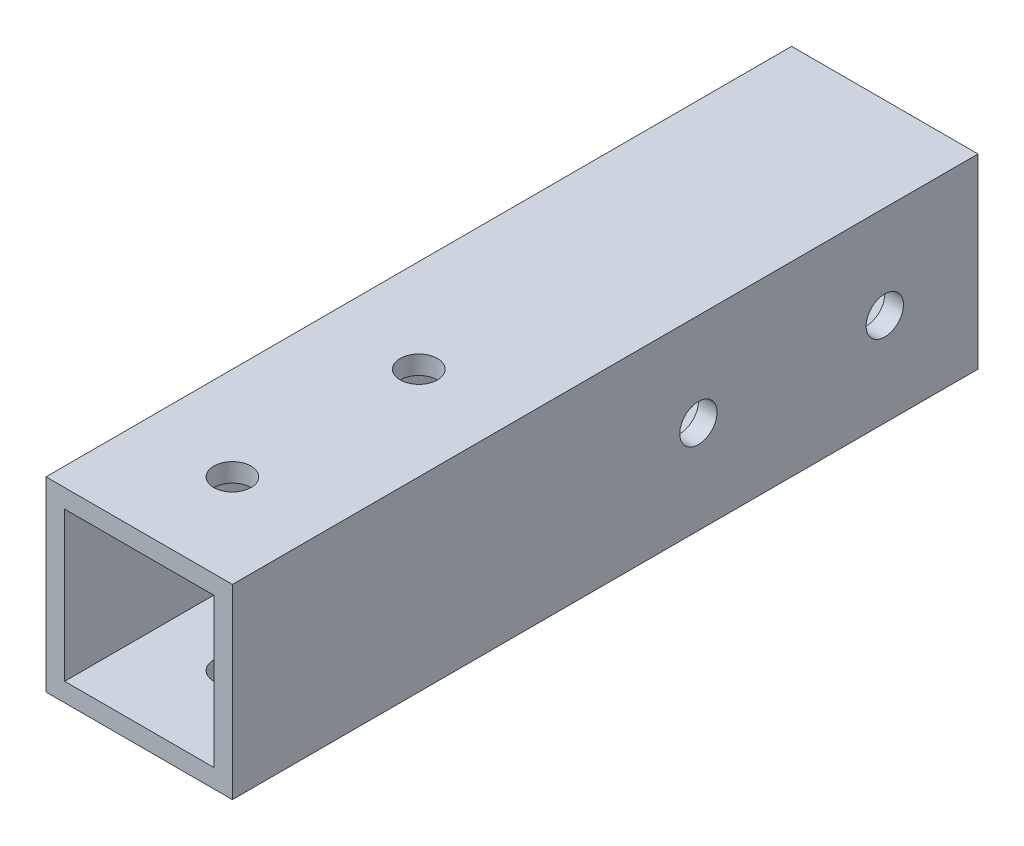
ISO-10303-21;
HEADER;
FILE_DESCRIPTION(('STEP AP214'),'2;1');
FILE_NAME('part.step','',(''),(''),'','','');
FILE_SCHEMA(('AUTOMOTIVE_DESIGN { 1 0 10303 214 1 1 1 1 }'));
ENDSEC;
DATA;
#1=APPLICATION_CONTEXT('core data for automotive mechanical design processes');
#2=APPLICATION_PROTOCOL_DEFINITION('international standard','automotive_design',2000,#1);
#3=PRODUCT_CONTEXT('',#1,'mechanical');
#4=PRODUCT('Part','Part','',(#3));
#5=PRODUCT_RELATED_PRODUCT_CATEGORY('part','',(#4));
#6=PRODUCT_DEFINITION_FORMATION('','',#4);
#7=PRODUCT_DEFINITION_CONTEXT('part definition',#1,'design');
#8=PRODUCT_DEFINITION('design','',#6,#7);
#9=PRODUCT_DEFINITION_SHAPE('','',#8);
#10=(LENGTH_UNIT() NAMED_UNIT(*) SI_UNIT(.MILLI.,.METRE.));
#11=(NAMED_UNIT(*) PLANE_ANGLE_UNIT() SI_UNIT($,.RADIAN.));
#12=(NAMED_UNIT(*) SI_UNIT($,.STERADIAN.) SOLID_ANGLE_UNIT());
#13=UNCERTAINTY_MEASURE_WITH_UNIT(LENGTH_MEASURE(1.E-05),#10,'distance_accuracy_value','');
#14=(GEOMETRIC_REPRESENTATION_CONTEXT(3) GLOBAL_UNCERTAINTY_ASSIGNED_CONTEXT((#13)) GLOBAL_UNIT_ASSIGNED_CONTEXT((#10,
#11,#12)) REPRESENTATION_CONTEXT('',''));
#15=CARTESIAN_POINT('',(0.,0.,0.));
#16=DIRECTION('',(0.,0.,1.));
#17=DIRECTION('',(1.,0.,0.));
#18=AXIS2_PLACEMENT_3D('',#15,#16,#17);
#19=CARTESIAN_POINT('',(0.,0.,80.));
#20=DIRECTION('',(0.,0.,-1.));
#21=DIRECTION('',(-1.,0.,0.));
#22=AXIS2_PLACEMENT_3D('',#19,#20,#21);
#23=PLANE('',#22);
#24=DIRECTION('',(0.,1.,0.));
#25=VECTOR('',#24,1.);
#26=CARTESIAN_POINT('',(10.,-10.,80.));
#27=LINE('',#26,#25);
#28=CARTESIAN_POINT('',(10.,-10.,80.));
#29=VERTEX_POINT('',#28);
#30=CARTESIAN_POINT('',(10.,10.,80.));
#31=VERTEX_POINT('',#30);
#32=EDGE_CURVE('E151',#29,#31,#27,.T.);
#33=ORIENTED_EDGE('',*,*,#32,.T.);
#34=DIRECTION('',(-1.,0.,0.));
#35=VECTOR('',#34,1.);
#36=CARTESIAN_POINT('',(-10.,10.,80.));
#37=LINE('',#36,#35);
#38=CARTESIAN_POINT('',(-10.,10.,80.));
#39=VERTEX_POINT('',#38);
#40=EDGE_CURVE('E154',#31,#39,#37,.T.);
#41=ORIENTED_EDGE('',*,*,#40,.T.);
#42=DIRECTION('',(0.,-1.,0.));
#43=VECTOR('',#42,1.);
#44=CARTESIAN_POINT('',(-10.,-10.,80.));
#45=LINE('',#44,#43);
#46=CARTESIAN_POINT('',(-10.,-10.,80.));
#47=VERTEX_POINT('',#46);
#48=EDGE_CURVE('E157',#39,#47,#45,.T.);
#49=ORIENTED_EDGE('',*,*,#48,.T.);
#50=DIRECTION('',(1.,0.,0.));
#51=VECTOR('',#50,1.);
#52=CARTESIAN_POINT('',(-10.,-10.,80.));
#53=LINE('',#52,#51);
#54=EDGE_CURVE('E159',#47,#29,#53,.T.);
#55=ORIENTED_EDGE('',*,*,#54,.T.);
#56=EDGE_LOOP('',(#33,#41,#49,#55));
#57=FACE_BOUND('',#56,.T.);
#58=DIRECTION('',(1.,0.,0.));
#59=VECTOR('',#58,1.);
#60=CARTESIAN_POINT('',(-8.,-8.,80.));
#61=LINE('',#60,#59);
#62=CARTESIAN_POINT('',(-8.,-8.,80.));
#63=VERTEX_POINT('',#62);
#64=CARTESIAN_POINT('',(8.,-8.,80.));
#65=VERTEX_POINT('',#64);
#66=EDGE_CURVE('E113',#63,#65,#61,.T.);
#67=ORIENTED_EDGE('',*,*,#66,.F.);
#68=DIRECTION('',(0.,-1.,0.));
#69=VECTOR('',#68,1.);
#70=CARTESIAN_POINT('',(-8.,-8.,80.));
#71=LINE('',#70,#69);
#72=CARTESIAN_POINT('',(-8.,8.,80.));
#73=VERTEX_POINT('',#72);
#74=EDGE_CURVE('E135',#73,#63,#71,.T.);
#75=ORIENTED_EDGE('',*,*,#74,.F.);
#76=DIRECTION('',(-1.,0.,0.));
#77=VECTOR('',#76,1.);
#78=CARTESIAN_POINT('',(-8.,8.,80.));
#79=LINE('',#78,#77);
#80=CARTESIAN_POINT('',(8.,8.,80.));
#81=VERTEX_POINT('',#80);
#82=EDGE_CURVE('E133',#81,#73,#79,.T.);
#83=ORIENTED_EDGE('',*,*,#82,.F.);
#84=DIRECTION('',(0.,1.,0.));
#85=VECTOR('',#84,1.);
#86=CARTESIAN_POINT('',(8.,-8.,80.));
#87=LINE('',#86,#85);
#88=EDGE_CURVE('E121',#65,#81,#87,.T.);
#89=ORIENTED_EDGE('',*,*,#88,.F.);
#90=EDGE_LOOP('',(#67,#75,#83,#89));
#91=FACE_BOUND('',#90,.T.);
#92=ADVANCED_FACE('F46',(#57,#91),#23,.F.);
#93=CARTESIAN_POINT('',(0.,0.,0.));
#94=DIRECTION('',(0.,0.,-1.));
#95=DIRECTION('',(-1.,0.,0.));
#96=AXIS2_PLACEMENT_3D('',#93,#94,#95);
#97=PLANE('',#96);
#98=DIRECTION('',(0.,1.,0.));
#99=VECTOR('',#98,1.);
#100=CARTESIAN_POINT('',(10.,-10.,0.));
#101=LINE('',#100,#99);
#102=CARTESIAN_POINT('',(10.,-10.,0.));
#103=VERTEX_POINT('',#102);
#104=CARTESIAN_POINT('',(10.,10.,0.));
#105=VERTEX_POINT('',#104);
#106=EDGE_CURVE('E129',#103,#105,#101,.T.);
#107=ORIENTED_EDGE('',*,*,#106,.F.);
#108=DIRECTION('',(1.,0.,0.));
#109=VECTOR('',#108,1.);
#110=CARTESIAN_POINT('',(-10.,-10.,0.));
#111=LINE('',#110,#109);
#112=CARTESIAN_POINT('',(-10.,-10.,0.));
#113=VERTEX_POINT('',#112);
#114=EDGE_CURVE('E155',#113,#103,#111,.T.);
#115=ORIENTED_EDGE('',*,*,#114,.F.);
#116=DIRECTION('',(0.,-1.,0.));
#117=VECTOR('',#116,1.);
#118=CARTESIAN_POINT('',(-10.,-10.,0.));
#119=LINE('',#118,#117);
#120=CARTESIAN_POINT('',(-10.,10.,0.));
#121=VERTEX_POINT('',#120);
#122=EDGE_CURVE('E291',#121,#113,#119,.T.);
#123=ORIENTED_EDGE('',*,*,#122,.F.);
#124=DIRECTION('',(-1.,0.,0.));
#125=VECTOR('',#124,1.);
#126=CARTESIAN_POINT('',(-10.,10.,0.));
#127=LINE('',#126,#125);
#128=EDGE_CURVE('E285',#105,#121,#127,.T.);
#129=ORIENTED_EDGE('',*,*,#128,.F.);
#130=EDGE_LOOP('',(#107,#115,#123,#129));
#131=FACE_BOUND('',#130,.T.);
#132=DIRECTION('',(0.,-1.,0.));
#133=VECTOR('',#132,1.);
#134=CARTESIAN_POINT('',(-8.,-8.,0.));
#135=LINE('',#134,#133);
#136=CARTESIAN_POINT('',(-8.,8.,0.));
#137=VERTEX_POINT('',#136);
#138=CARTESIAN_POINT('',(-8.,-8.,0.));
#139=VERTEX_POINT('',#138);
#140=EDGE_CURVE('E122',#137,#139,#135,.T.);
#141=ORIENTED_EDGE('',*,*,#140,.T.);
#142=DIRECTION('',(1.,0.,0.));
#143=VECTOR('',#142,1.);
#144=CARTESIAN_POINT('',(-8.,-8.,0.));
#145=LINE('',#144,#143);
#146=CARTESIAN_POINT('',(8.,-8.,0.));
#147=VERTEX_POINT('',#146);
#148=EDGE_CURVE('E71',#139,#147,#145,.T.);
#149=ORIENTED_EDGE('',*,*,#148,.T.);
#150=DIRECTION('',(0.,1.,0.));
#151=VECTOR('',#150,1.);
#152=CARTESIAN_POINT('',(8.,-8.,0.));
#153=LINE('',#152,#151);
#154=CARTESIAN_POINT('',(8.,8.,0.));
#155=VERTEX_POINT('',#154);
#156=EDGE_CURVE('E128',#147,#155,#153,.T.);
#157=ORIENTED_EDGE('',*,*,#156,.T.);
#158=DIRECTION('',(-1.,0.,0.));
#159=VECTOR('',#158,1.);
#160=CARTESIAN_POINT('',(-8.,8.,0.));
#161=LINE('',#160,#159);
#162=EDGE_CURVE('E143',#155,#137,#161,.T.);
#163=ORIENTED_EDGE('',*,*,#162,.T.);
#164=EDGE_LOOP('',(#141,#149,#157,#163));
#165=FACE_BOUND('',#164,.T.);
#166=ADVANCED_FACE('F257',(#131,#165),#97,.T.);
#167=CARTESIAN_POINT('',(10.,-10.,80.));
#168=DIRECTION('',(-1.,0.,0.));
#169=DIRECTION('',(0.,-1.,0.));
#170=AXIS2_PLACEMENT_3D('',#167,#168,#169);
#171=PLANE('',#170);
#172=CARTESIAN_POINT('',(10.,0.,10.));
#173=DIRECTION('',(1.,0.,0.));
#174=DIRECTION('',(0.,1.,0.));
#175=AXIS2_PLACEMENT_3D('',#172,#173,#174);
#176=CIRCLE('',#175,2.);
#177=CARTESIAN_POINT('',(10.,2.,10.));
#178=VERTEX_POINT('',#177);
#179=EDGE_CURVE('E186',#178,#178,#176,.T.);
#180=ORIENTED_EDGE('',*,*,#179,.F.);
#181=EDGE_LOOP('',(#180));
#182=FACE_BOUND('',#181,.T.);
#183=CARTESIAN_POINT('',(10.,-1.4206298902349E-13,30.));
#184=DIRECTION('',(1.,0.,0.));
#185=DIRECTION('',(0.,1.,0.));
#186=AXIS2_PLACEMENT_3D('',#183,#184,#185);
#187=CIRCLE('',#186,2.);
#188=CARTESIAN_POINT('',(10.,1.99999999999986,30.));
#189=VERTEX_POINT('',#188);
#190=EDGE_CURVE('E221',#189,#189,#187,.T.);
#191=ORIENTED_EDGE('',*,*,#190,.F.);
#192=EDGE_LOOP('',(#191));
#193=FACE_BOUND('',#192,.T.);
#194=ORIENTED_EDGE('',*,*,#106,.T.);
#195=DIRECTION('',(0.,0.,-1.));
#196=VECTOR('',#195,1.);
#197=CARTESIAN_POINT('',(10.,10.,80.));
#198=LINE('',#197,#196);
#199=EDGE_CURVE('E12',#31,#105,#198,.T.);
#200=ORIENTED_EDGE('',*,*,#199,.F.);
#201=ORIENTED_EDGE('',*,*,#32,.F.);
#202=DIRECTION('',(0.,0.,-1.));
#203=VECTOR('',#202,1.);
#204=CARTESIAN_POINT('',(10.,-10.,80.));
#205=LINE('',#204,#203);
#206=EDGE_CURVE('E163',#29,#103,#205,.T.);
#207=ORIENTED_EDGE('',*,*,#206,.T.);
#208=EDGE_LOOP('',(#194,#200,#201,#207));
#209=FACE_BOUND('',#208,.T.);
#210=ADVANCED_FACE('F48',(#182,#193,#209),#171,.F.);
#211=CARTESIAN_POINT('',(-10.,10.,80.));
#212=DIRECTION('',(0.,-1.,0.));
#213=DIRECTION('',(1.,0.,0.));
#214=AXIS2_PLACEMENT_3D('',#211,#212,#213);
#215=PLANE('',#214);
#216=CARTESIAN_POINT('',(0.,10.,50.));
#217=DIRECTION('',(0.,-1.,0.));
#218=DIRECTION('',(1.,0.,0.));
#219=AXIS2_PLACEMENT_3D('',#216,#217,#218);
#220=CIRCLE('',#219,2.00000000000001);
#221=CARTESIAN_POINT('',(2.00000000000001,10.,50.));
#222=VERTEX_POINT('',#221);
#223=EDGE_CURVE('E218',#222,#222,#220,.T.);
#224=ORIENTED_EDGE('',*,*,#223,.T.);
#225=EDGE_LOOP('',(#224));
#226=FACE_BOUND('',#225,.T.);
#227=CARTESIAN_POINT('',(0.,10.,70.));
#228=DIRECTION('',(0.,-1.,0.));
#229=DIRECTION('',(1.,0.,0.));
#230=AXIS2_PLACEMENT_3D('',#227,#228,#229);
#231=CIRCLE('',#230,2.);
#232=CARTESIAN_POINT('',(2.00000000000001,10.,70.));
#233=VERTEX_POINT('',#232);
#234=EDGE_CURVE('E198',#233,#233,#231,.T.);
#235=ORIENTED_EDGE('',*,*,#234,.T.);
#236=EDGE_LOOP('',(#235));
#237=FACE_BOUND('',#236,.T.);
#238=ORIENTED_EDGE('',*,*,#128,.T.);
#239=DIRECTION('',(0.,0.,-1.));
#240=VECTOR('',#239,1.);
#241=CARTESIAN_POINT('',(-10.,10.,80.));
#242=LINE('',#241,#240);
#243=EDGE_CURVE('E55',#39,#121,#242,.T.);
#244=ORIENTED_EDGE('',*,*,#243,.F.);
#245=ORIENTED_EDGE('',*,*,#40,.F.);
#246=ORIENTED_EDGE('',*,*,#199,.T.);
#247=EDGE_LOOP('',(#238,#244,#245,#246));
#248=FACE_BOUND('',#247,.T.);
#249=ADVANCED_FACE('F273',(#226,#237,#248),#215,.F.);
#250=CARTESIAN_POINT('',(-10.,-10.,80.));
#251=DIRECTION('',(1.,0.,0.));
#252=DIRECTION('',(0.,0.,-1.));
#253=AXIS2_PLACEMENT_3D('',#250,#251,#252);
#254=PLANE('',#253);
#255=CARTESIAN_POINT('',(-10.,0.,10.));
#256=DIRECTION('',(1.,0.,0.));
#257=DIRECTION('',(0.,0.,-1.));
#258=AXIS2_PLACEMENT_3D('',#255,#256,#257);
#259=CIRCLE('',#258,2.);
#260=CARTESIAN_POINT('',(-10.,0.,8.));
#261=VERTEX_POINT('',#260);
#262=EDGE_CURVE('E141',#261,#261,#259,.T.);
#263=ORIENTED_EDGE('',*,*,#262,.T.);
#264=EDGE_LOOP('',(#263));
#265=FACE_BOUND('',#264,.T.);
#266=CARTESIAN_POINT('',(-10.,-1.43797712499467E-13,30.));
#267=DIRECTION('',(1.,0.,0.));
#268=DIRECTION('',(0.,0.,-1.));
#269=AXIS2_PLACEMENT_3D('',#266,#267,#268);
#270=CIRCLE('',#269,2.);
#271=CARTESIAN_POINT('',(-10.,-1.43797712499467E-13,28.));
#272=VERTEX_POINT('',#271);
#273=EDGE_CURVE('E190',#272,#272,#270,.T.);
#274=ORIENTED_EDGE('',*,*,#273,.T.);
#275=EDGE_LOOP('',(#274));
#276=FACE_BOUND('',#275,.T.);
#277=ORIENTED_EDGE('',*,*,#122,.T.);
#278=DIRECTION('',(0.,0.,-1.));
#279=VECTOR('',#278,1.);
#280=CARTESIAN_POINT('',(-10.,-10.,80.));
#281=LINE('',#280,#279);
#282=EDGE_CURVE('E173',#47,#113,#281,.T.);
#283=ORIENTED_EDGE('',*,*,#282,.F.);
#284=ORIENTED_EDGE('',*,*,#48,.F.);
#285=ORIENTED_EDGE('',*,*,#243,.T.);
#286=EDGE_LOOP('',(#277,#283,#284,#285));
#287=FACE_BOUND('',#286,.T.);
#288=ADVANCED_FACE('F234',(#265,#276,#287),#254,.F.);
#289=CARTESIAN_POINT('',(-10.,-10.,80.));
#290=DIRECTION('',(0.,1.,0.));
#291=DIRECTION('',(-1.,0.,0.));
#292=AXIS2_PLACEMENT_3D('',#289,#290,#291);
#293=PLANE('',#292);
#294=CARTESIAN_POINT('',(0.,-10.,50.));
#295=DIRECTION('',(0.,-1.,0.));
#296=DIRECTION('',(1.,0.,0.));
#297=AXIS2_PLACEMENT_3D('',#294,#295,#296);
#298=CIRCLE('',#297,2.00000000000001);
#299=CARTESIAN_POINT('',(2.00000000000001,-10.,50.));
#300=VERTEX_POINT('',#299);
#301=EDGE_CURVE('E194',#300,#300,#298,.T.);
#302=ORIENTED_EDGE('',*,*,#301,.F.);
#303=EDGE_LOOP('',(#302));
#304=FACE_BOUND('',#303,.T.);
#305=CARTESIAN_POINT('',(0.,-10.,70.));
#306=DIRECTION('',(0.,-1.,0.));
#307=DIRECTION('',(1.,0.,0.));
#308=AXIS2_PLACEMENT_3D('',#305,#306,#307);
#309=CIRCLE('',#308,2.);
#310=CARTESIAN_POINT('',(2.00000000000001,-10.,70.));
#311=VERTEX_POINT('',#310);
#312=EDGE_CURVE('E202',#311,#311,#309,.T.);
#313=ORIENTED_EDGE('',*,*,#312,.F.);
#314=EDGE_LOOP('',(#313));
#315=FACE_BOUND('',#314,.T.);
#316=ORIENTED_EDGE('',*,*,#114,.T.);
#317=ORIENTED_EDGE('',*,*,#206,.F.);
#318=ORIENTED_EDGE('',*,*,#54,.F.);
#319=ORIENTED_EDGE('',*,*,#282,.T.);
#320=EDGE_LOOP('',(#316,#317,#318,#319));
#321=FACE_BOUND('',#320,.T.);
#322=ADVANCED_FACE('F268',(#304,#315,#321),#293,.F.);
#323=CARTESIAN_POINT('',(-8.,-8.,80.));
#324=DIRECTION('',(0.,1.,0.));
#325=DIRECTION('',(0.,0.,1.));
#326=AXIS2_PLACEMENT_3D('',#323,#324,#325);
#327=PLANE('',#326);
#328=CARTESIAN_POINT('',(0.,-8.00000000000001,50.));
#329=DIRECTION('',(0.,1.,0.));
#330=DIRECTION('',(0.,0.,1.));
#331=AXIS2_PLACEMENT_3D('',#328,#329,#330);
#332=CIRCLE('',#331,2.00000000000001);
#333=CARTESIAN_POINT('',(0.,-8.00000000000001,52.));
#334=VERTEX_POINT('',#333);
#335=EDGE_CURVE('E215',#334,#334,#332,.T.);
#336=ORIENTED_EDGE('',*,*,#335,.F.);
#337=EDGE_LOOP('',(#336));
#338=FACE_BOUND('',#337,.T.);
#339=CARTESIAN_POINT('',(0.,-8.00000000000001,70.));
#340=DIRECTION('',(0.,1.,0.));
#341=DIRECTION('',(0.,0.,1.));
#342=AXIS2_PLACEMENT_3D('',#339,#340,#341);
#343=CIRCLE('',#342,2.);
#344=CARTESIAN_POINT('',(0.,-8.00000000000001,72.));
#345=VERTEX_POINT('',#344);
#346=EDGE_CURVE('E193',#345,#345,#343,.T.);
#347=ORIENTED_EDGE('',*,*,#346,.F.);
#348=EDGE_LOOP('',(#347));
#349=FACE_BOUND('',#348,.T.);
#350=ORIENTED_EDGE('',*,*,#148,.F.);
#351=DIRECTION('',(0.,0.,-1.));
#352=VECTOR('',#351,1.);
#353=CARTESIAN_POINT('',(-8.,-8.,80.));
#354=LINE('',#353,#352);
#355=EDGE_CURVE('E117',#63,#139,#354,.T.);
#356=ORIENTED_EDGE('',*,*,#355,.F.);
#357=ORIENTED_EDGE('',*,*,#66,.T.);
#358=DIRECTION('',(0.,0.,-1.));
#359=VECTOR('',#358,1.);
#360=CARTESIAN_POINT('',(8.,-8.,80.));
#361=LINE('',#360,#359);
#362=EDGE_CURVE('E116',#65,#147,#361,.T.);
#363=ORIENTED_EDGE('',*,*,#362,.T.);
#364=EDGE_LOOP('',(#350,#356,#357,#363));
#365=FACE_BOUND('',#364,.T.);
#366=ADVANCED_FACE('F115',(#338,#349,#365),#327,.T.);
#367=CARTESIAN_POINT('',(8.,-8.,80.));
#368=DIRECTION('',(-1.,0.,0.));
#369=DIRECTION('',(0.,0.,1.));
#370=AXIS2_PLACEMENT_3D('',#367,#368,#369);
#371=PLANE('',#370);
#372=CARTESIAN_POINT('',(8.00000000000001,0.,10.));
#373=DIRECTION('',(-1.,0.,0.));
#374=DIRECTION('',(0.,0.,1.));
#375=AXIS2_PLACEMENT_3D('',#372,#373,#374);
#376=CIRCLE('',#375,2.);
#377=CARTESIAN_POINT('',(8.00000000000001,0.,12.));
#378=VERTEX_POINT('',#377);
#379=EDGE_CURVE('E189',#378,#378,#376,.T.);
#380=ORIENTED_EDGE('',*,*,#379,.F.);
#381=EDGE_LOOP('',(#380));
#382=FACE_BOUND('',#381,.T.);
#383=CARTESIAN_POINT('',(8.00000000000001,-1.42236461371088E-13,30.));
#384=DIRECTION('',(-1.,0.,0.));
#385=DIRECTION('',(0.,0.,1.));
#386=AXIS2_PLACEMENT_3D('',#383,#384,#385);
#387=CIRCLE('',#386,2.);
#388=CARTESIAN_POINT('',(8.00000000000001,-1.42236461371088E-13,32.));
#389=VERTEX_POINT('',#388);
#390=EDGE_CURVE('E185',#389,#389,#387,.T.);
#391=ORIENTED_EDGE('',*,*,#390,.F.);
#392=EDGE_LOOP('',(#391));
#393=FACE_BOUND('',#392,.T.);
#394=ORIENTED_EDGE('',*,*,#156,.F.);
#395=ORIENTED_EDGE('',*,*,#362,.F.);
#396=ORIENTED_EDGE('',*,*,#88,.T.);
#397=DIRECTION('',(0.,0.,-1.));
#398=VECTOR('',#397,1.);
#399=CARTESIAN_POINT('',(8.,8.,80.));
#400=LINE('',#399,#398);
#401=EDGE_CURVE('E130',#81,#155,#400,.T.);
#402=ORIENTED_EDGE('',*,*,#401,.T.);
#403=EDGE_LOOP('',(#394,#395,#396,#402));
#404=FACE_BOUND('',#403,.T.);
#405=ADVANCED_FACE('F125',(#382,#393,#404),#371,.T.);
#406=CARTESIAN_POINT('',(-8.,8.,80.));
#407=DIRECTION('',(0.,-1.,0.));
#408=DIRECTION('',(0.,0.,-1.));
#409=AXIS2_PLACEMENT_3D('',#406,#407,#408);
#410=PLANE('',#409);
#411=CARTESIAN_POINT('',(0.,8.00000000000001,50.));
#412=DIRECTION('',(0.,-1.,0.));
#413=DIRECTION('',(0.,0.,-1.));
#414=AXIS2_PLACEMENT_3D('',#411,#412,#413);
#415=CIRCLE('',#414,2.00000000000001);
#416=CARTESIAN_POINT('',(0.,8.00000000000001,48.));
#417=VERTEX_POINT('',#416);
#418=EDGE_CURVE('E50',#417,#417,#415,.T.);
#419=ORIENTED_EDGE('',*,*,#418,.F.);
#420=EDGE_LOOP('',(#419));
#421=FACE_BOUND('',#420,.T.);
#422=CARTESIAN_POINT('',(0.,8.00000000000001,70.));
#423=DIRECTION('',(0.,-1.,0.));
#424=DIRECTION('',(0.,0.,-1.));
#425=AXIS2_PLACEMENT_3D('',#422,#423,#424);
#426=CIRCLE('',#425,2.);
#427=CARTESIAN_POINT('',(0.,8.00000000000001,68.));
#428=VERTEX_POINT('',#427);
#429=EDGE_CURVE('E191',#428,#428,#426,.T.);
#430=ORIENTED_EDGE('',*,*,#429,.F.);
#431=EDGE_LOOP('',(#430));
#432=FACE_BOUND('',#431,.T.);
#433=ORIENTED_EDGE('',*,*,#162,.F.);
#434=ORIENTED_EDGE('',*,*,#401,.F.);
#435=ORIENTED_EDGE('',*,*,#82,.T.);
#436=DIRECTION('',(0.,0.,-1.));
#437=VECTOR('',#436,1.);
#438=CARTESIAN_POINT('',(-8.,8.,80.));
#439=LINE('',#438,#437);
#440=EDGE_CURVE('E63',#73,#137,#439,.T.);
#441=ORIENTED_EDGE('',*,*,#440,.T.);
#442=EDGE_LOOP('',(#433,#434,#435,#441));
#443=FACE_BOUND('',#442,.T.);
#444=ADVANCED_FACE('F304',(#421,#432,#443),#410,.T.);
#445=CARTESIAN_POINT('',(-8.,-8.,80.));
#446=DIRECTION('',(1.,0.,0.));
#447=DIRECTION('',(0.,0.,-1.));
#448=AXIS2_PLACEMENT_3D('',#445,#446,#447);
#449=PLANE('',#448);
#450=CARTESIAN_POINT('',(-8.00000000000001,0.,10.));
#451=DIRECTION('',(1.,0.,0.));
#452=DIRECTION('',(0.,0.,-1.));
#453=AXIS2_PLACEMENT_3D('',#450,#451,#452);
#454=CIRCLE('',#453,2.);
#455=CARTESIAN_POINT('',(-8.00000000000001,0.,8.));
#456=VERTEX_POINT('',#455);
#457=EDGE_CURVE('E187',#456,#456,#454,.T.);
#458=ORIENTED_EDGE('',*,*,#457,.F.);
#459=EDGE_LOOP('',(#458));
#460=FACE_BOUND('',#459,.T.);
#461=CARTESIAN_POINT('',(-8.00000000000001,-1.4362424015187E-13,30.));
#462=DIRECTION('',(1.,0.,0.));
#463=DIRECTION('',(0.,0.,-1.));
#464=AXIS2_PLACEMENT_3D('',#461,#462,#463);
#465=CIRCLE('',#464,2.);
#466=CARTESIAN_POINT('',(-8.00000000000001,-1.4362424015187E-13,28.));
#467=VERTEX_POINT('',#466);
#468=EDGE_CURVE('E182',#467,#467,#465,.T.);
#469=ORIENTED_EDGE('',*,*,#468,.F.);
#470=EDGE_LOOP('',(#469));
#471=FACE_BOUND('',#470,.T.);
#472=ORIENTED_EDGE('',*,*,#140,.F.);
#473=ORIENTED_EDGE('',*,*,#440,.F.);
#474=ORIENTED_EDGE('',*,*,#74,.T.);
#475=ORIENTED_EDGE('',*,*,#355,.T.);
#476=EDGE_LOOP('',(#472,#473,#474,#475));
#477=FACE_BOUND('',#476,.T.);
#478=ADVANCED_FACE('F250',(#460,#471,#477),#449,.T.);
#479=CARTESIAN_POINT('',(-90.,-1.50736606403374E-13,30.));
#480=DIRECTION('',(1.,0.,0.));
#481=DIRECTION('',(0.,1.,0.));
#482=AXIS2_PLACEMENT_3D('',#479,#480,#481);
#483=CYLINDRICAL_SURFACE('',#482,2.);
#484=ORIENTED_EDGE('',*,*,#468,.T.);
#485=EDGE_LOOP('',(#484));
#486=FACE_BOUND('',#485,.T.);
#487=ORIENTED_EDGE('',*,*,#273,.F.);
#488=EDGE_LOOP('',(#487));
#489=FACE_BOUND('',#488,.T.);
#490=ADVANCED_FACE('F240',(#486,#489),#483,.F.);
#491=CARTESIAN_POINT('',(-90.,0.,10.));
#492=DIRECTION('',(1.,0.,0.));
#493=DIRECTION('',(0.,1.,0.));
#494=AXIS2_PLACEMENT_3D('',#491,#492,#493);
#495=CYLINDRICAL_SURFACE('',#494,2.);
#496=ORIENTED_EDGE('',*,*,#457,.T.);
#497=EDGE_LOOP('',(#496));
#498=FACE_BOUND('',#497,.T.);
#499=ORIENTED_EDGE('',*,*,#262,.F.);
#500=EDGE_LOOP('',(#499));
#501=FACE_BOUND('',#500,.T.);
#502=ADVANCED_FACE('F237',(#498,#501),#495,.F.);
#503=ORIENTED_EDGE('',*,*,#390,.T.);
#504=EDGE_LOOP('',(#503));
#505=FACE_BOUND('',#504,.T.);
#506=ORIENTED_EDGE('',*,*,#190,.T.);
#507=EDGE_LOOP('',(#506));
#508=FACE_BOUND('',#507,.T.);
#509=ADVANCED_FACE('F239',(#505,#508),#483,.F.);
#510=ORIENTED_EDGE('',*,*,#379,.T.);
#511=EDGE_LOOP('',(#510));
#512=FACE_BOUND('',#511,.T.);
#513=ORIENTED_EDGE('',*,*,#179,.T.);
#514=EDGE_LOOP('',(#513));
#515=FACE_BOUND('',#514,.T.);
#516=ADVANCED_FACE('F243',(#512,#515),#495,.F.);
#517=CARTESIAN_POINT('',(0.,90.,70.));
#518=DIRECTION('',(0.,-1.,0.));
#519=DIRECTION('',(1.,0.,0.));
#520=AXIS2_PLACEMENT_3D('',#517,#518,#519);
#521=CYLINDRICAL_SURFACE('',#520,2.);
#522=ORIENTED_EDGE('',*,*,#429,.T.);
#523=EDGE_LOOP('',(#522));
#524=FACE_BOUND('',#523,.T.);
#525=ORIENTED_EDGE('',*,*,#234,.F.);
#526=EDGE_LOOP('',(#525));
#527=FACE_BOUND('',#526,.T.);
#528=ADVANCED_FACE('F254',(#524,#527),#521,.F.);
#529=CARTESIAN_POINT('',(0.,90.,50.));
#530=DIRECTION('',(0.,-1.,0.));
#531=DIRECTION('',(1.,0.,0.));
#532=AXIS2_PLACEMENT_3D('',#529,#530,#531);
#533=CYLINDRICAL_SURFACE('',#532,2.00000000000001);
#534=ORIENTED_EDGE('',*,*,#418,.T.);
#535=EDGE_LOOP('',(#534));
#536=FACE_BOUND('',#535,.T.);
#537=ORIENTED_EDGE('',*,*,#223,.F.);
#538=EDGE_LOOP('',(#537));
#539=FACE_BOUND('',#538,.T.);
#540=ADVANCED_FACE('F338',(#536,#539),#533,.F.);
#541=ORIENTED_EDGE('',*,*,#346,.T.);
#542=EDGE_LOOP('',(#541));
#543=FACE_BOUND('',#542,.T.);
#544=ORIENTED_EDGE('',*,*,#312,.T.);
#545=EDGE_LOOP('',(#544));
#546=FACE_BOUND('',#545,.T.);
#547=ADVANCED_FACE('F334',(#543,#546),#521,.F.);
#548=ORIENTED_EDGE('',*,*,#335,.T.);
#549=EDGE_LOOP('',(#548));
#550=FACE_BOUND('',#549,.T.);
#551=ORIENTED_EDGE('',*,*,#301,.T.);
#552=EDGE_LOOP('',(#551));
#553=FACE_BOUND('',#552,.T.);
#554=ADVANCED_FACE('F337',(#550,#553),#533,.F.);
#555=CLOSED_SHELL('',(#92,#166,#210,#249,#288,#322,#366,#405,#444,#478,#490,#502,#509,#516,#528,
#540,#547,#554));
#556=MANIFOLD_SOLID_BREP('B2',#555);
#557=ADVANCED_BREP_SHAPE_REPRESENTATION('',(#18,#556),#14);
#558=SHAPE_DEFINITION_REPRESENTATION(#9,#557);
ENDSEC;
END-ISO-10303-21;
